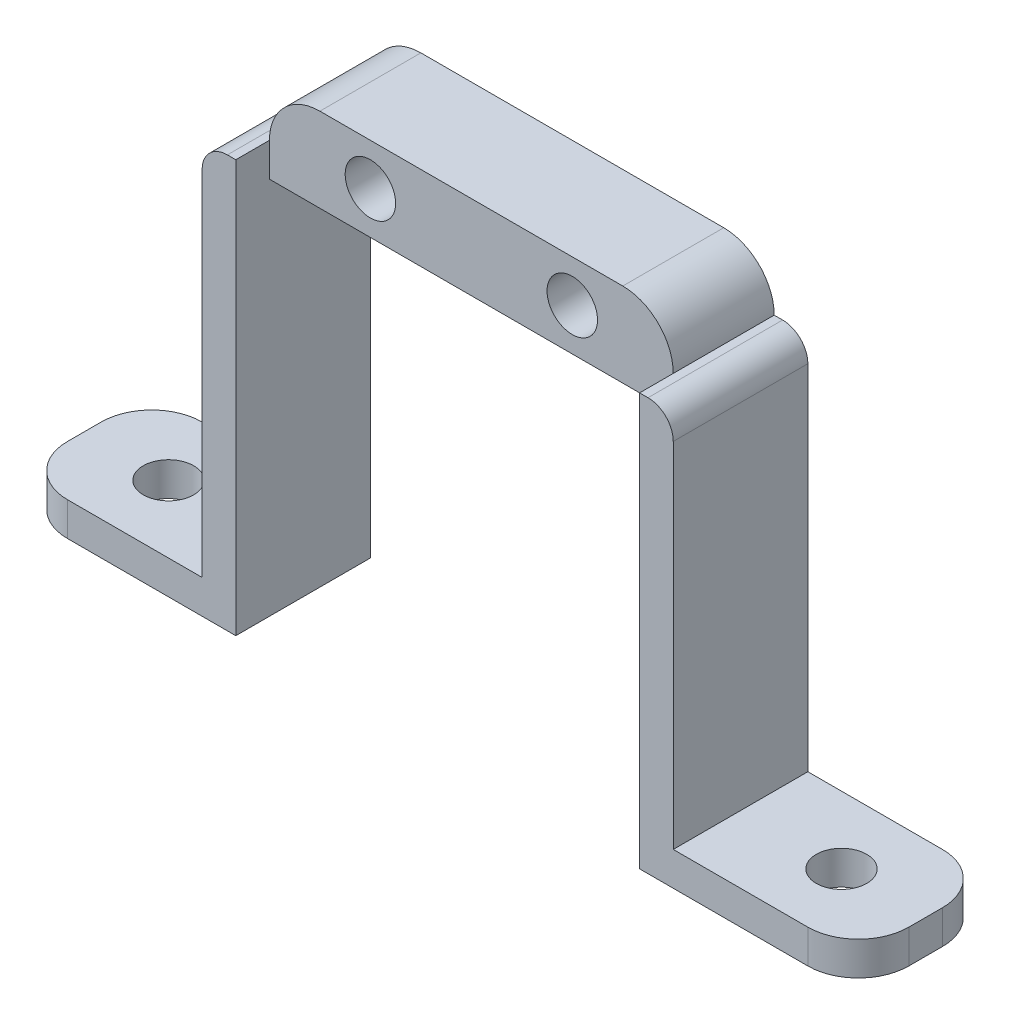
ISO-10303-21;
HEADER;
FILE_DESCRIPTION(('STEP AP214'),'2;1');
FILE_NAME('part.step','',(''),(''),'','','');
FILE_SCHEMA(('AUTOMOTIVE_DESIGN { 1 0 10303 214 1 1 1 1 }'));
ENDSEC;
DATA;
#1=APPLICATION_CONTEXT('core data for automotive mechanical design processes');
#2=APPLICATION_PROTOCOL_DEFINITION('international standard','automotive_design',2000,#1);
#3=PRODUCT_CONTEXT('',#1,'mechanical');
#4=PRODUCT('Part','Part','',(#3));
#5=PRODUCT_RELATED_PRODUCT_CATEGORY('part','',(#4));
#6=PRODUCT_DEFINITION_FORMATION('','',#4);
#7=PRODUCT_DEFINITION_CONTEXT('part definition',#1,'design');
#8=PRODUCT_DEFINITION('design','',#6,#7);
#9=PRODUCT_DEFINITION_SHAPE('','',#8);
#10=(LENGTH_UNIT() NAMED_UNIT(*) SI_UNIT(.MILLI.,.METRE.));
#11=(NAMED_UNIT(*) PLANE_ANGLE_UNIT() SI_UNIT($,.RADIAN.));
#12=(NAMED_UNIT(*) SI_UNIT($,.STERADIAN.) SOLID_ANGLE_UNIT());
#13=UNCERTAINTY_MEASURE_WITH_UNIT(LENGTH_MEASURE(1.E-05),#10,'distance_accuracy_value','');
#14=(GEOMETRIC_REPRESENTATION_CONTEXT(3) GLOBAL_UNCERTAINTY_ASSIGNED_CONTEXT((#13)) GLOBAL_UNIT_ASSIGNED_CONTEXT((#10,
#11,#12)) REPRESENTATION_CONTEXT('',''));
#15=CARTESIAN_POINT('',(0.,0.,0.));
#16=DIRECTION('',(0.,0.,1.));
#17=DIRECTION('',(1.,0.,0.));
#18=AXIS2_PLACEMENT_3D('',#15,#16,#17);
#19=CARTESIAN_POINT('',(13.,24.5,8.));
#20=DIRECTION('',(0.,1.,0.));
#21=DIRECTION('',(0.,0.,1.));
#22=AXIS2_PLACEMENT_3D('',#19,#20,#21);
#23=PLANE('',#22);
#24=DIRECTION('',(1.,0.,0.));
#25=VECTOR('',#24,1.);
#26=CARTESIAN_POINT('',(13.,24.5,0.));
#27=LINE('',#26,#25);
#28=CARTESIAN_POINT('',(12.5,24.5,0.));
#29=VERTEX_POINT('',#28);
#30=CARTESIAN_POINT('',(13.,24.5,0.));
#31=VERTEX_POINT('',#30);
#32=EDGE_CURVE('E213',#29,#31,#27,.T.);
#33=ORIENTED_EDGE('',*,*,#32,.F.);
#34=DIRECTION('',(0.,0.,-1.));
#35=VECTOR('',#34,1.);
#36=CARTESIAN_POINT('',(12.5,24.5,8.));
#37=LINE('',#36,#35);
#38=CARTESIAN_POINT('',(12.5,24.5,8.));
#39=VERTEX_POINT('',#38);
#40=EDGE_CURVE('E45',#29,#39,#37,.F.);
#41=ORIENTED_EDGE('',*,*,#40,.T.);
#42=DIRECTION('',(1.,0.,0.));
#43=VECTOR('',#42,1.);
#44=CARTESIAN_POINT('',(13.,24.5,8.));
#45=LINE('',#44,#43);
#46=CARTESIAN_POINT('',(13.,24.5,8.));
#47=VERTEX_POINT('',#46);
#48=EDGE_CURVE('E253',#39,#47,#45,.T.);
#49=ORIENTED_EDGE('',*,*,#48,.T.);
#50=DIRECTION('',(0.,0.,1.));
#51=VECTOR('',#50,1.);
#52=CARTESIAN_POINT('',(13.,24.5,6.));
#53=LINE('',#52,#51);
#54=CARTESIAN_POINT('',(13.,24.5,6.));
#55=VERTEX_POINT('',#54);
#56=EDGE_CURVE('E238',#55,#47,#53,.T.);
#57=ORIENTED_EDGE('',*,*,#56,.F.);
#58=DIRECTION('',(0.,0.,1.));
#59=VECTOR('',#58,1.);
#60=CARTESIAN_POINT('',(13.,24.5,6.));
#61=LINE('',#60,#59);
#62=EDGE_CURVE('E220',#31,#55,#61,.T.);
#63=ORIENTED_EDGE('',*,*,#62,.F.);
#64=EDGE_LOOP('',(#33,#41,#49,#57,#63));
#65=FACE_BOUND('',#64,.T.);
#66=ADVANCED_FACE('F37',(#65),#23,.T.);
#67=CARTESIAN_POINT('',(0.,0.,8.));
#68=DIRECTION('',(0.,0.,-1.));
#69=DIRECTION('',(-1.,0.,0.));
#70=AXIS2_PLACEMENT_3D('',#67,#68,#69);
#71=PLANE('',#70);
#72=ORIENTED_EDGE('',*,*,#48,.F.);
#73=CARTESIAN_POINT('',(12.5,23.,8.));
#74=DIRECTION('',(0.,0.,-1.));
#75=DIRECTION('',(-1.,0.,0.));
#76=AXIS2_PLACEMENT_3D('',#73,#74,#75);
#77=CIRCLE('',#76,1.5);
#78=CARTESIAN_POINT('',(11.,23.,8.));
#79=VERTEX_POINT('',#78);
#80=EDGE_CURVE('E11',#39,#79,#77,.F.);
#81=ORIENTED_EDGE('',*,*,#80,.T.);
#82=DIRECTION('',(0.,1.,0.));
#83=VECTOR('',#82,1.);
#84=CARTESIAN_POINT('',(11.,0.,8.));
#85=LINE('',#84,#83);
#86=CARTESIAN_POINT('',(11.,2.,8.));
#87=VERTEX_POINT('',#86);
#88=EDGE_CURVE('E255',#87,#79,#85,.T.);
#89=ORIENTED_EDGE('',*,*,#88,.F.);
#90=DIRECTION('',(1.,0.,0.));
#91=VECTOR('',#90,1.);
#92=CARTESIAN_POINT('',(0.,2.,8.));
#93=LINE('',#92,#91);
#94=CARTESIAN_POINT('',(3.,2.,8.));
#95=VERTEX_POINT('',#94);
#96=EDGE_CURVE('E257',#95,#87,#93,.T.);
#97=ORIENTED_EDGE('',*,*,#96,.F.);
#98=DIRECTION('',(0.,1.,0.));
#99=VECTOR('',#98,1.);
#100=CARTESIAN_POINT('',(3.,0.,8.));
#101=LINE('',#100,#99);
#102=CARTESIAN_POINT('',(3.,0.,8.));
#103=VERTEX_POINT('',#102);
#104=EDGE_CURVE('E367',#95,#103,#101,.F.);
#105=ORIENTED_EDGE('',*,*,#104,.T.);
#106=DIRECTION('',(1.,0.,0.));
#107=VECTOR('',#106,1.);
#108=CARTESIAN_POINT('',(0.,0.,8.));
#109=LINE('',#108,#107);
#110=CARTESIAN_POINT('',(13.,0.,8.));
#111=VERTEX_POINT('',#110);
#112=EDGE_CURVE('E259',#103,#111,#109,.T.);
#113=ORIENTED_EDGE('',*,*,#112,.T.);
#114=DIRECTION('',(0.,1.,0.));
#115=VECTOR('',#114,1.);
#116=CARTESIAN_POINT('',(13.,0.,8.));
#117=LINE('',#116,#115);
#118=EDGE_CURVE('E261',#111,#47,#117,.T.);
#119=ORIENTED_EDGE('',*,*,#118,.T.);
#120=EDGE_LOOP('',(#72,#81,#89,#97,#105,#113,#119));
#121=FACE_BOUND('',#120,.T.);
#122=ADVANCED_FACE('F392',(#121),#71,.F.);
#123=CARTESIAN_POINT('',(37.,0.,8.));
#124=DIRECTION('',(0.,1.,0.));
#125=DIRECTION('',(0.,0.,1.));
#126=AXIS2_PLACEMENT_3D('',#123,#124,#125);
#127=PLANE('',#126);
#128=CARTESIAN_POINT('',(45.,0.,4.));
#129=DIRECTION('',(0.,-1.,0.));
#130=DIRECTION('',(0.,0.,-1.));
#131=AXIS2_PLACEMENT_3D('',#128,#129,#130);
#132=CIRCLE('',#131,1.5);
#133=CARTESIAN_POINT('',(45.,0.,2.5));
#134=VERTEX_POINT('',#133);
#135=EDGE_CURVE('E703',#134,#134,#132,.T.);
#136=ORIENTED_EDGE('',*,*,#135,.F.);
#137=EDGE_LOOP('',(#136));
#138=FACE_BOUND('',#137,.T.);
#139=DIRECTION('',(0.,0.,-1.));
#140=VECTOR('',#139,1.);
#141=CARTESIAN_POINT('',(50.,0.,8.));
#142=LINE('',#141,#140);
#143=CARTESIAN_POINT('',(50.,0.,5.));
#144=VERTEX_POINT('',#143);
#145=CARTESIAN_POINT('',(50.,0.,3.));
#146=VERTEX_POINT('',#145);
#147=EDGE_CURVE('E311',#144,#146,#142,.T.);
#148=ORIENTED_EDGE('',*,*,#147,.F.);
#149=CARTESIAN_POINT('',(47.,0.,5.));
#150=DIRECTION('',(0.,1.,0.));
#151=DIRECTION('',(0.,0.,1.));
#152=AXIS2_PLACEMENT_3D('',#149,#150,#151);
#153=CIRCLE('',#152,3.);
#154=CARTESIAN_POINT('',(47.,0.,8.));
#155=VERTEX_POINT('',#154);
#156=EDGE_CURVE('E346',#144,#155,#153,.F.);
#157=ORIENTED_EDGE('',*,*,#156,.T.);
#158=DIRECTION('',(1.,0.,0.));
#159=VECTOR('',#158,1.);
#160=CARTESIAN_POINT('',(37.,0.,8.));
#161=LINE('',#160,#159);
#162=CARTESIAN_POINT('',(37.,0.,8.));
#163=VERTEX_POINT('',#162);
#164=EDGE_CURVE('E243',#163,#155,#161,.T.);
#165=ORIENTED_EDGE('',*,*,#164,.F.);
#166=DIRECTION('',(0.,0.,-1.));
#167=VECTOR('',#166,1.);
#168=CARTESIAN_POINT('',(37.,0.,8.));
#169=LINE('',#168,#167);
#170=CARTESIAN_POINT('',(37.,0.,0.));
#171=VERTEX_POINT('',#170);
#172=EDGE_CURVE('E266',#163,#171,#169,.T.);
#173=ORIENTED_EDGE('',*,*,#172,.T.);
#174=DIRECTION('',(1.,0.,0.));
#175=VECTOR('',#174,1.);
#176=CARTESIAN_POINT('',(37.,0.,0.));
#177=LINE('',#176,#175);
#178=CARTESIAN_POINT('',(47.,0.,0.));
#179=VERTEX_POINT('',#178);
#180=EDGE_CURVE('E241',#171,#179,#177,.T.);
#181=ORIENTED_EDGE('',*,*,#180,.T.);
#182=CARTESIAN_POINT('',(47.,0.,3.));
#183=DIRECTION('',(0.,1.,0.));
#184=DIRECTION('',(0.,0.,1.));
#185=AXIS2_PLACEMENT_3D('',#182,#183,#184);
#186=CIRCLE('',#185,3.);
#187=EDGE_CURVE('E344',#179,#146,#186,.F.);
#188=ORIENTED_EDGE('',*,*,#187,.T.);
#189=EDGE_LOOP('',(#148,#157,#165,#173,#181,#188));
#190=FACE_BOUND('',#189,.T.);
#191=ADVANCED_FACE('F430',(#138,#190),#127,.F.);
#192=CARTESIAN_POINT('',(50.,2.,8.));
#193=DIRECTION('',(1.,0.,0.));
#194=DIRECTION('',(0.,0.,-1.));
#195=AXIS2_PLACEMENT_3D('',#192,#193,#194);
#196=PLANE('',#195);
#197=DIRECTION('',(0.,0.,-1.));
#198=VECTOR('',#197,1.);
#199=CARTESIAN_POINT('',(50.,2.,8.));
#200=LINE('',#199,#198);
#201=CARTESIAN_POINT('',(50.,2.,5.));
#202=VERTEX_POINT('',#201);
#203=CARTESIAN_POINT('',(50.,2.,3.));
#204=VERTEX_POINT('',#203);
#205=EDGE_CURVE('E308',#202,#204,#200,.T.);
#206=ORIENTED_EDGE('',*,*,#205,.F.);
#207=DIRECTION('',(0.,-1.,0.));
#208=VECTOR('',#207,1.);
#209=CARTESIAN_POINT('',(50.,0.,5.));
#210=LINE('',#209,#208);
#211=EDGE_CURVE('E341',#202,#144,#210,.T.);
#212=ORIENTED_EDGE('',*,*,#211,.T.);
#213=ORIENTED_EDGE('',*,*,#147,.T.);
#214=DIRECTION('',(0.,-1.,0.));
#215=VECTOR('',#214,1.);
#216=CARTESIAN_POINT('',(50.,2.,3.));
#217=LINE('',#216,#215);
#218=EDGE_CURVE('E339',#146,#204,#217,.F.);
#219=ORIENTED_EDGE('',*,*,#218,.T.);
#220=EDGE_LOOP('',(#206,#212,#213,#219));
#221=FACE_BOUND('',#220,.T.);
#222=ADVANCED_FACE('F446',(#221),#196,.T.);
#223=CARTESIAN_POINT('',(37.,2.,8.));
#224=DIRECTION('',(0.,1.,0.));
#225=DIRECTION('',(0.,0.,1.));
#226=AXIS2_PLACEMENT_3D('',#223,#224,#225);
#227=PLANE('',#226);
#228=CARTESIAN_POINT('',(45.,2.,4.));
#229=DIRECTION('',(0.,1.,0.));
#230=DIRECTION('',(0.,0.,1.));
#231=AXIS2_PLACEMENT_3D('',#228,#229,#230);
#232=CIRCLE('',#231,1.5);
#233=CARTESIAN_POINT('',(45.,2.,5.5));
#234=VERTEX_POINT('',#233);
#235=EDGE_CURVE('E321',#234,#234,#232,.T.);
#236=ORIENTED_EDGE('',*,*,#235,.F.);
#237=EDGE_LOOP('',(#236));
#238=FACE_BOUND('',#237,.T.);
#239=DIRECTION('',(1.,0.,0.));
#240=VECTOR('',#239,1.);
#241=CARTESIAN_POINT('',(37.,2.,8.));
#242=LINE('',#241,#240);
#243=CARTESIAN_POINT('',(39.,2.,8.));
#244=VERTEX_POINT('',#243);
#245=CARTESIAN_POINT('',(47.,2.,8.));
#246=VERTEX_POINT('',#245);
#247=EDGE_CURVE('E246',#244,#246,#242,.T.);
#248=ORIENTED_EDGE('',*,*,#247,.T.);
#249=CARTESIAN_POINT('',(47.,2.,5.));
#250=DIRECTION('',(0.,1.,0.));
#251=DIRECTION('',(0.,0.,1.));
#252=AXIS2_PLACEMENT_3D('',#249,#250,#251);
#253=CIRCLE('',#252,3.);
#254=EDGE_CURVE('E352',#246,#202,#253,.T.);
#255=ORIENTED_EDGE('',*,*,#254,.T.);
#256=ORIENTED_EDGE('',*,*,#205,.T.);
#257=CARTESIAN_POINT('',(47.,2.,3.));
#258=DIRECTION('',(0.,1.,0.));
#259=DIRECTION('',(0.,0.,1.));
#260=AXIS2_PLACEMENT_3D('',#257,#258,#259);
#261=CIRCLE('',#260,3.);
#262=CARTESIAN_POINT('',(47.,2.,0.));
#263=VERTEX_POINT('',#262);
#264=EDGE_CURVE('E350',#204,#263,#261,.T.);
#265=ORIENTED_EDGE('',*,*,#264,.T.);
#266=DIRECTION('',(1.,0.,0.));
#267=VECTOR('',#266,1.);
#268=CARTESIAN_POINT('',(37.,2.,0.));
#269=LINE('',#268,#267);
#270=CARTESIAN_POINT('',(39.,2.,0.));
#271=VERTEX_POINT('',#270);
#272=EDGE_CURVE('E269',#271,#263,#269,.T.);
#273=ORIENTED_EDGE('',*,*,#272,.F.);
#274=DIRECTION('',(0.,0.,-1.));
#275=VECTOR('',#274,1.);
#276=CARTESIAN_POINT('',(39.,2.,8.));
#277=LINE('',#276,#275);
#278=EDGE_CURVE('E305',#244,#271,#277,.T.);
#279=ORIENTED_EDGE('',*,*,#278,.F.);
#280=EDGE_LOOP('',(#248,#255,#256,#265,#273,#279));
#281=FACE_BOUND('',#280,.T.);
#282=ADVANCED_FACE('F441',(#238,#281),#227,.T.);
#283=CARTESIAN_POINT('',(39.,22.5,8.));
#284=DIRECTION('',(1.,0.,0.));
#285=DIRECTION('',(0.,0.,-1.));
#286=AXIS2_PLACEMENT_3D('',#283,#284,#285);
#287=PLANE('',#286);
#288=DIRECTION('',(0.,1.,0.));
#289=VECTOR('',#288,1.);
#290=CARTESIAN_POINT('',(39.,22.5,0.));
#291=LINE('',#290,#289);
#292=CARTESIAN_POINT('',(39.,23.,0.));
#293=VERTEX_POINT('',#292);
#294=EDGE_CURVE('E214',#293,#271,#291,.F.);
#295=ORIENTED_EDGE('',*,*,#294,.F.);
#296=DIRECTION('',(0.,0.,-1.));
#297=VECTOR('',#296,1.);
#298=CARTESIAN_POINT('',(39.,23.,8.));
#299=LINE('',#298,#297);
#300=CARTESIAN_POINT('',(39.,23.,8.));
#301=VERTEX_POINT('',#300);
#302=EDGE_CURVE('E374',#293,#301,#299,.F.);
#303=ORIENTED_EDGE('',*,*,#302,.T.);
#304=DIRECTION('',(0.,1.,0.));
#305=VECTOR('',#304,1.);
#306=CARTESIAN_POINT('',(39.,22.5,8.));
#307=LINE('',#306,#305);
#308=EDGE_CURVE('E250',#301,#244,#307,.F.);
#309=ORIENTED_EDGE('',*,*,#308,.T.);
#310=ORIENTED_EDGE('',*,*,#278,.T.);
#311=EDGE_LOOP('',(#295,#303,#309,#310));
#312=FACE_BOUND('',#311,.T.);
#313=ADVANCED_FACE('F436',(#312),#287,.T.);
#314=CARTESIAN_POINT('',(37.,24.5,8.));
#315=VERTEX_POINT('',#314);
#316=CARTESIAN_POINT('',(37.5,24.5,8.));
#317=VERTEX_POINT('',#316);
#318=EDGE_CURVE('E252',#315,#317,#45,.T.);
#319=ORIENTED_EDGE('',*,*,#318,.T.);
#320=DIRECTION('',(0.,0.,-1.));
#321=VECTOR('',#320,1.);
#322=CARTESIAN_POINT('',(37.5,24.5,8.));
#323=LINE('',#322,#321);
#324=CARTESIAN_POINT('',(37.5,24.5,0.));
#325=VERTEX_POINT('',#324);
#326=EDGE_CURVE('E212',#317,#325,#323,.T.);
#327=ORIENTED_EDGE('',*,*,#326,.T.);
#328=CARTESIAN_POINT('',(37.,24.5,0.));
#329=VERTEX_POINT('',#328);
#330=EDGE_CURVE('E194',#329,#325,#27,.T.);
#331=ORIENTED_EDGE('',*,*,#330,.F.);
#332=DIRECTION('',(0.,0.,-1.));
#333=VECTOR('',#332,1.);
#334=CARTESIAN_POINT('',(37.,24.5,6.));
#335=LINE('',#334,#333);
#336=CARTESIAN_POINT('',(37.,24.5,6.));
#337=VERTEX_POINT('',#336);
#338=EDGE_CURVE('E209',#337,#329,#335,.T.);
#339=ORIENTED_EDGE('',*,*,#338,.F.);
#340=DIRECTION('',(0.,0.,1.));
#341=VECTOR('',#340,1.);
#342=CARTESIAN_POINT('',(37.,24.5,6.));
#343=LINE('',#342,#341);
#344=EDGE_CURVE('E237',#337,#315,#343,.T.);
#345=ORIENTED_EDGE('',*,*,#344,.T.);
#346=EDGE_LOOP('',(#319,#327,#331,#339,#345));
#347=FACE_BOUND('',#346,.T.);
#348=ADVANCED_FACE('F207',(#347),#23,.T.);
#349=CARTESIAN_POINT('',(11.,0.,8.));
#350=DIRECTION('',(-1.,0.,0.));
#351=DIRECTION('',(0.,0.,1.));
#352=AXIS2_PLACEMENT_3D('',#349,#350,#351);
#353=PLANE('',#352);
#354=ORIENTED_EDGE('',*,*,#88,.T.);
#355=DIRECTION('',(0.,0.,-1.));
#356=VECTOR('',#355,1.);
#357=CARTESIAN_POINT('',(11.,23.,8.));
#358=LINE('',#357,#356);
#359=CARTESIAN_POINT('',(11.,23.,0.));
#360=VERTEX_POINT('',#359);
#361=EDGE_CURVE('E378',#79,#360,#358,.T.);
#362=ORIENTED_EDGE('',*,*,#361,.T.);
#363=DIRECTION('',(0.,1.,0.));
#364=VECTOR('',#363,1.);
#365=CARTESIAN_POINT('',(11.,0.,0.));
#366=LINE('',#365,#364);
#367=CARTESIAN_POINT('',(11.,2.,0.));
#368=VERTEX_POINT('',#367);
#369=EDGE_CURVE('E273',#368,#360,#366,.T.);
#370=ORIENTED_EDGE('',*,*,#369,.F.);
#371=DIRECTION('',(0.,0.,-1.));
#372=VECTOR('',#371,1.);
#373=CARTESIAN_POINT('',(11.,2.,8.));
#374=LINE('',#373,#372);
#375=EDGE_CURVE('E302',#87,#368,#374,.T.);
#376=ORIENTED_EDGE('',*,*,#375,.F.);
#377=EDGE_LOOP('',(#354,#362,#370,#376));
#378=FACE_BOUND('',#377,.T.);
#379=ADVANCED_FACE('F383',(#378),#353,.T.);
#380=CARTESIAN_POINT('',(0.,2.,8.));
#381=DIRECTION('',(0.,1.,0.));
#382=DIRECTION('',(0.,0.,1.));
#383=AXIS2_PLACEMENT_3D('',#380,#381,#382);
#384=PLANE('',#383);
#385=CARTESIAN_POINT('',(5.,2.,3.99999999999999));
#386=DIRECTION('',(0.,1.,0.));
#387=DIRECTION('',(0.,0.,1.));
#388=AXIS2_PLACEMENT_3D('',#385,#386,#387);
#389=CIRCLE('',#388,1.5);
#390=CARTESIAN_POINT('',(5.,2.,5.5));
#391=VERTEX_POINT('',#390);
#392=EDGE_CURVE('E325',#391,#391,#389,.T.);
#393=ORIENTED_EDGE('',*,*,#392,.F.);
#394=EDGE_LOOP('',(#393));
#395=FACE_BOUND('',#394,.T.);
#396=DIRECTION('',(1.,0.,0.));
#397=VECTOR('',#396,1.);
#398=CARTESIAN_POINT('',(0.,2.,0.));
#399=LINE('',#398,#397);
#400=CARTESIAN_POINT('',(3.,2.,0.));
#401=VERTEX_POINT('',#400);
#402=EDGE_CURVE('E276',#401,#368,#399,.T.);
#403=ORIENTED_EDGE('',*,*,#402,.F.);
#404=CARTESIAN_POINT('',(3.,2.,3.));
#405=DIRECTION('',(0.,1.,0.));
#406=DIRECTION('',(0.,0.,1.));
#407=AXIS2_PLACEMENT_3D('',#404,#405,#406);
#408=CIRCLE('',#407,3.);
#409=CARTESIAN_POINT('',(0.,2.,3.));
#410=VERTEX_POINT('',#409);
#411=EDGE_CURVE('E356',#401,#410,#408,.T.);
#412=ORIENTED_EDGE('',*,*,#411,.T.);
#413=DIRECTION('',(0.,0.,-1.));
#414=VECTOR('',#413,1.);
#415=CARTESIAN_POINT('',(0.,2.,8.));
#416=LINE('',#415,#414);
#417=CARTESIAN_POINT('',(0.,2.,5.));
#418=VERTEX_POINT('',#417);
#419=EDGE_CURVE('E299',#418,#410,#416,.T.);
#420=ORIENTED_EDGE('',*,*,#419,.F.);
#421=CARTESIAN_POINT('',(3.,2.,5.));
#422=DIRECTION('',(0.,1.,0.));
#423=DIRECTION('',(0.,0.,1.));
#424=AXIS2_PLACEMENT_3D('',#421,#422,#423);
#425=CIRCLE('',#424,3.);
#426=EDGE_CURVE('E354',#418,#95,#425,.T.);
#427=ORIENTED_EDGE('',*,*,#426,.T.);
#428=ORIENTED_EDGE('',*,*,#96,.T.);
#429=ORIENTED_EDGE('',*,*,#375,.T.);
#430=EDGE_LOOP('',(#403,#412,#420,#427,#428,#429));
#431=FACE_BOUND('',#430,.T.);
#432=ADVANCED_FACE('F390',(#395,#431),#384,.T.);
#433=CARTESIAN_POINT('',(0.,0.,8.));
#434=DIRECTION('',(-1.,0.,0.));
#435=DIRECTION('',(0.,0.,1.));
#436=AXIS2_PLACEMENT_3D('',#433,#434,#435);
#437=PLANE('',#436);
#438=ORIENTED_EDGE('',*,*,#419,.T.);
#439=DIRECTION('',(0.,1.,0.));
#440=VECTOR('',#439,1.);
#441=CARTESIAN_POINT('',(0.,0.,3.));
#442=LINE('',#441,#440);
#443=CARTESIAN_POINT('',(0.,0.,3.));
#444=VERTEX_POINT('',#443);
#445=EDGE_CURVE('E361',#410,#444,#442,.F.);
#446=ORIENTED_EDGE('',*,*,#445,.T.);
#447=DIRECTION('',(0.,0.,-1.));
#448=VECTOR('',#447,1.);
#449=CARTESIAN_POINT('',(0.,0.,8.));
#450=LINE('',#449,#448);
#451=CARTESIAN_POINT('',(0.,0.,5.));
#452=VERTEX_POINT('',#451);
#453=EDGE_CURVE('E296',#452,#444,#450,.T.);
#454=ORIENTED_EDGE('',*,*,#453,.F.);
#455=DIRECTION('',(0.,1.,0.));
#456=VECTOR('',#455,1.);
#457=CARTESIAN_POINT('',(0.,2.,5.));
#458=LINE('',#457,#456);
#459=EDGE_CURVE('E358',#452,#418,#458,.T.);
#460=ORIENTED_EDGE('',*,*,#459,.T.);
#461=EDGE_LOOP('',(#438,#446,#454,#460));
#462=FACE_BOUND('',#461,.T.);
#463=ADVANCED_FACE('F405',(#462),#437,.T.);
#464=CARTESIAN_POINT('',(0.,0.,8.));
#465=DIRECTION('',(0.,1.,0.));
#466=DIRECTION('',(0.,0.,1.));
#467=AXIS2_PLACEMENT_3D('',#464,#465,#466);
#468=PLANE('',#467);
#469=CARTESIAN_POINT('',(5.,0.,3.99999999999999));
#470=DIRECTION('',(0.,-1.,0.));
#471=DIRECTION('',(0.,0.,1.));
#472=AXIS2_PLACEMENT_3D('',#469,#470,#471);
#473=CIRCLE('',#472,1.5);
#474=CARTESIAN_POINT('',(5.,0.,5.5));
#475=VERTEX_POINT('',#474);
#476=EDGE_CURVE('E704',#475,#475,#473,.T.);
#477=ORIENTED_EDGE('',*,*,#476,.F.);
#478=EDGE_LOOP('',(#477));
#479=FACE_BOUND('',#478,.T.);
#480=ORIENTED_EDGE('',*,*,#453,.T.);
#481=CARTESIAN_POINT('',(3.,0.,3.));
#482=DIRECTION('',(0.,1.,0.));
#483=DIRECTION('',(0.,0.,1.));
#484=AXIS2_PLACEMENT_3D('',#481,#482,#483);
#485=CIRCLE('',#484,3.);
#486=CARTESIAN_POINT('',(3.,0.,0.));
#487=VERTEX_POINT('',#486);
#488=EDGE_CURVE('E365',#444,#487,#485,.F.);
#489=ORIENTED_EDGE('',*,*,#488,.T.);
#490=DIRECTION('',(1.,0.,0.));
#491=VECTOR('',#490,1.);
#492=CARTESIAN_POINT('',(0.,0.,0.));
#493=LINE('',#492,#491);
#494=CARTESIAN_POINT('',(13.,0.,0.));
#495=VERTEX_POINT('',#494);
#496=EDGE_CURVE('E278',#487,#495,#493,.T.);
#497=ORIENTED_EDGE('',*,*,#496,.T.);
#498=DIRECTION('',(0.,0.,-1.));
#499=VECTOR('',#498,1.);
#500=CARTESIAN_POINT('',(13.,0.,8.));
#501=LINE('',#500,#499);
#502=EDGE_CURVE('E293',#111,#495,#501,.T.);
#503=ORIENTED_EDGE('',*,*,#502,.F.);
#504=ORIENTED_EDGE('',*,*,#112,.F.);
#505=CARTESIAN_POINT('',(3.,0.,5.));
#506=DIRECTION('',(0.,1.,0.));
#507=DIRECTION('',(0.,0.,1.));
#508=AXIS2_PLACEMENT_3D('',#505,#506,#507);
#509=CIRCLE('',#508,3.);
#510=EDGE_CURVE('E363',#103,#452,#509,.F.);
#511=ORIENTED_EDGE('',*,*,#510,.T.);
#512=EDGE_LOOP('',(#480,#489,#497,#503,#504,#511));
#513=FACE_BOUND('',#512,.T.);
#514=ADVANCED_FACE('F401',(#479,#513),#468,.F.);
#515=CARTESIAN_POINT('',(13.,0.,8.));
#516=DIRECTION('',(-1.,0.,0.));
#517=DIRECTION('',(0.,0.,1.));
#518=AXIS2_PLACEMENT_3D('',#515,#516,#517);
#519=PLANE('',#518);
#520=DIRECTION('',(0.,1.,0.));
#521=VECTOR('',#520,1.);
#522=CARTESIAN_POINT('',(13.,0.,0.));
#523=LINE('',#522,#521);
#524=CARTESIAN_POINT('',(13.,22.5,0.));
#525=VERTEX_POINT('',#524);
#526=EDGE_CURVE('E280',#495,#525,#523,.T.);
#527=ORIENTED_EDGE('',*,*,#526,.T.);
#528=DIRECTION('',(0.,0.,-1.));
#529=VECTOR('',#528,1.);
#530=CARTESIAN_POINT('',(13.,22.5,8.));
#531=LINE('',#530,#529);
#532=CARTESIAN_POINT('',(13.,22.5,6.));
#533=VERTEX_POINT('',#532);
#534=EDGE_CURVE('E291',#533,#525,#531,.T.);
#535=ORIENTED_EDGE('',*,*,#534,.F.);
#536=DIRECTION('',(0.,-1.,0.));
#537=VECTOR('',#536,1.);
#538=CARTESIAN_POINT('',(13.,22.5,6.));
#539=LINE('',#538,#537);
#540=EDGE_CURVE('E229',#55,#533,#539,.T.);
#541=ORIENTED_EDGE('',*,*,#540,.F.);
#542=ORIENTED_EDGE('',*,*,#56,.T.);
#543=ORIENTED_EDGE('',*,*,#118,.F.);
#544=ORIENTED_EDGE('',*,*,#502,.T.);
#545=EDGE_LOOP('',(#527,#535,#541,#542,#543,#544));
#546=FACE_BOUND('',#545,.T.);
#547=ADVANCED_FACE('F415',(#546),#519,.F.);
#548=CARTESIAN_POINT('',(13.,22.5,8.));
#549=DIRECTION('',(0.,1.,0.));
#550=DIRECTION('',(0.,0.,1.));
#551=AXIS2_PLACEMENT_3D('',#548,#549,#550);
#552=PLANE('',#551);
#553=DIRECTION('',(0.,0.,-1.));
#554=VECTOR('',#553,1.);
#555=CARTESIAN_POINT('',(37.,22.5,8.));
#556=LINE('',#555,#554);
#557=CARTESIAN_POINT('',(37.,22.5,6.));
#558=VERTEX_POINT('',#557);
#559=CARTESIAN_POINT('',(37.,22.5,0.));
#560=VERTEX_POINT('',#559);
#561=EDGE_CURVE('E289',#558,#560,#556,.T.);
#562=ORIENTED_EDGE('',*,*,#561,.F.);
#563=DIRECTION('',(1.,0.,0.));
#564=VECTOR('',#563,1.);
#565=CARTESIAN_POINT('',(13.,22.5,6.));
#566=LINE('',#565,#564);
#567=EDGE_CURVE('E231',#533,#558,#566,.T.);
#568=ORIENTED_EDGE('',*,*,#567,.F.);
#569=ORIENTED_EDGE('',*,*,#534,.T.);
#570=DIRECTION('',(1.,0.,0.));
#571=VECTOR('',#570,1.);
#572=CARTESIAN_POINT('',(13.,22.5,0.));
#573=LINE('',#572,#571);
#574=EDGE_CURVE('E283',#525,#560,#573,.T.);
#575=ORIENTED_EDGE('',*,*,#574,.T.);
#576=EDGE_LOOP('',(#562,#568,#569,#575));
#577=FACE_BOUND('',#576,.T.);
#578=ADVANCED_FACE('F557',(#577),#552,.F.);
#579=CARTESIAN_POINT('',(37.,22.5,8.));
#580=DIRECTION('',(1.,0.,0.));
#581=DIRECTION('',(0.,0.,-1.));
#582=AXIS2_PLACEMENT_3D('',#579,#580,#581);
#583=PLANE('',#582);
#584=DIRECTION('',(0.,-1.,0.));
#585=VECTOR('',#584,1.);
#586=CARTESIAN_POINT('',(37.,22.5,0.));
#587=LINE('',#586,#585);
#588=EDGE_CURVE('E247',#560,#171,#587,.T.);
#589=ORIENTED_EDGE('',*,*,#588,.T.);
#590=ORIENTED_EDGE('',*,*,#172,.F.);
#591=DIRECTION('',(0.,-1.,0.));
#592=VECTOR('',#591,1.);
#593=CARTESIAN_POINT('',(37.,22.5,8.));
#594=LINE('',#593,#592);
#595=EDGE_CURVE('E264',#315,#163,#594,.T.);
#596=ORIENTED_EDGE('',*,*,#595,.F.);
#597=ORIENTED_EDGE('',*,*,#344,.F.);
#598=DIRECTION('',(0.,1.,0.));
#599=VECTOR('',#598,1.);
#600=CARTESIAN_POINT('',(37.,22.5,6.));
#601=LINE('',#600,#599);
#602=EDGE_CURVE('E234',#558,#337,#601,.T.);
#603=ORIENTED_EDGE('',*,*,#602,.F.);
#604=ORIENTED_EDGE('',*,*,#561,.T.);
#605=EDGE_LOOP('',(#589,#590,#596,#597,#603,#604));
#606=FACE_BOUND('',#605,.T.);
#607=ADVANCED_FACE('F510',(#606),#583,.F.);
#608=ORIENTED_EDGE('',*,*,#308,.F.);
#609=CARTESIAN_POINT('',(37.5,23.,8.));
#610=DIRECTION('',(0.,0.,-1.));
#611=DIRECTION('',(-1.,0.,0.));
#612=AXIS2_PLACEMENT_3D('',#609,#610,#611);
#613=CIRCLE('',#612,1.5);
#614=EDGE_CURVE('E376',#301,#317,#613,.F.);
#615=ORIENTED_EDGE('',*,*,#614,.T.);
#616=ORIENTED_EDGE('',*,*,#318,.F.);
#617=ORIENTED_EDGE('',*,*,#595,.T.);
#618=ORIENTED_EDGE('',*,*,#164,.T.);
#619=DIRECTION('',(0.,-1.,0.));
#620=VECTOR('',#619,1.);
#621=CARTESIAN_POINT('',(47.,2.,8.));
#622=LINE('',#621,#620);
#623=EDGE_CURVE('E348',#155,#246,#622,.F.);
#624=ORIENTED_EDGE('',*,*,#623,.T.);
#625=ORIENTED_EDGE('',*,*,#247,.F.);
#626=EDGE_LOOP('',(#608,#615,#616,#617,#618,#624,#625));
#627=FACE_BOUND('',#626,.T.);
#628=ADVANCED_FACE('F432',(#627),#71,.F.);
#629=CARTESIAN_POINT('',(0.,0.,0.));
#630=DIRECTION('',(0.,0.,-1.));
#631=DIRECTION('',(-1.,0.,0.));
#632=AXIS2_PLACEMENT_3D('',#629,#630,#631);
#633=PLANE('',#632);
#634=CARTESIAN_POINT('',(19.,25.,0.));
#635=DIRECTION('',(0.,0.,-1.));
#636=DIRECTION('',(-1.,0.,0.));
#637=AXIS2_PLACEMENT_3D('',#634,#635,#636);
#638=CIRCLE('',#637,1.5);
#639=CARTESIAN_POINT('',(17.5,25.,0.));
#640=VERTEX_POINT('',#639);
#641=EDGE_CURVE('E318',#640,#640,#638,.T.);
#642=ORIENTED_EDGE('',*,*,#641,.F.);
#643=EDGE_LOOP('',(#642));
#644=FACE_BOUND('',#643,.T.);
#645=CARTESIAN_POINT('',(31.,25.,0.));
#646=DIRECTION('',(0.,0.,-1.));
#647=DIRECTION('',(1.,0.,0.));
#648=AXIS2_PLACEMENT_3D('',#645,#646,#647);
#649=CIRCLE('',#648,1.5);
#650=CARTESIAN_POINT('',(32.5,25.,0.));
#651=VERTEX_POINT('',#650);
#652=EDGE_CURVE('E324',#651,#651,#649,.T.);
#653=ORIENTED_EDGE('',*,*,#652,.F.);
#654=EDGE_LOOP('',(#653));
#655=FACE_BOUND('',#654,.T.);
#656=ORIENTED_EDGE('',*,*,#330,.T.);
#657=CARTESIAN_POINT('',(37.5,23.,0.));
#658=DIRECTION('',(0.,0.,-1.));
#659=DIRECTION('',(-1.,0.,0.));
#660=AXIS2_PLACEMENT_3D('',#657,#658,#659);
#661=CIRCLE('',#660,1.5);
#662=EDGE_CURVE('E372',#325,#293,#661,.T.);
#663=ORIENTED_EDGE('',*,*,#662,.T.);
#664=ORIENTED_EDGE('',*,*,#294,.T.);
#665=ORIENTED_EDGE('',*,*,#272,.T.);
#666=DIRECTION('',(0.,-1.,0.));
#667=VECTOR('',#666,1.);
#668=CARTESIAN_POINT('',(47.,0.,0.));
#669=LINE('',#668,#667);
#670=EDGE_CURVE('E202',#263,#179,#669,.T.);
#671=ORIENTED_EDGE('',*,*,#670,.T.);
#672=ORIENTED_EDGE('',*,*,#180,.F.);
#673=ORIENTED_EDGE('',*,*,#588,.F.);
#674=ORIENTED_EDGE('',*,*,#574,.F.);
#675=ORIENTED_EDGE('',*,*,#526,.F.);
#676=ORIENTED_EDGE('',*,*,#496,.F.);
#677=DIRECTION('',(0.,1.,0.));
#678=VECTOR('',#677,1.);
#679=CARTESIAN_POINT('',(3.,0.,0.));
#680=LINE('',#679,#678);
#681=EDGE_CURVE('E333',#487,#401,#680,.T.);
#682=ORIENTED_EDGE('',*,*,#681,.T.);
#683=ORIENTED_EDGE('',*,*,#402,.T.);
#684=ORIENTED_EDGE('',*,*,#369,.T.);
#685=CARTESIAN_POINT('',(12.5,23.,0.));
#686=DIRECTION('',(0.,0.,-1.));
#687=DIRECTION('',(-1.,0.,0.));
#688=AXIS2_PLACEMENT_3D('',#685,#686,#687);
#689=CIRCLE('',#688,1.5);
#690=EDGE_CURVE('E370',#360,#29,#689,.T.);
#691=ORIENTED_EDGE('',*,*,#690,.T.);
#692=ORIENTED_EDGE('',*,*,#32,.T.);
#693=CARTESIAN_POINT('',(16.,24.5,0.));
#694=DIRECTION('',(0.,0.,-1.));
#695=DIRECTION('',(-1.,0.,0.));
#696=AXIS2_PLACEMENT_3D('',#693,#694,#695);
#697=CIRCLE('',#696,3.);
#698=CARTESIAN_POINT('',(16.,27.5,0.));
#699=VERTEX_POINT('',#698);
#700=EDGE_CURVE('E201',#31,#699,#697,.T.);
#701=ORIENTED_EDGE('',*,*,#700,.T.);
#702=DIRECTION('',(-1.,0.,0.));
#703=VECTOR('',#702,1.);
#704=CARTESIAN_POINT('',(13.,27.5,0.));
#705=LINE('',#704,#703);
#706=CARTESIAN_POINT('',(34.,27.5,0.));
#707=VERTEX_POINT('',#706);
#708=EDGE_CURVE('E196',#707,#699,#705,.T.);
#709=ORIENTED_EDGE('',*,*,#708,.F.);
#710=CARTESIAN_POINT('',(34.,24.5,0.));
#711=DIRECTION('',(0.,0.,-1.));
#712=DIRECTION('',(-1.,0.,0.));
#713=AXIS2_PLACEMENT_3D('',#710,#711,#712);
#714=CIRCLE('',#713,3.);
#715=EDGE_CURVE('E191',#707,#329,#714,.T.);
#716=ORIENTED_EDGE('',*,*,#715,.T.);
#717=EDGE_LOOP('',(#656,#663,#664,#665,#671,#672,#673,#674,#675,#676,#682,#683,#684,#691,#692,
#701,#709,#716));
#718=FACE_BOUND('',#717,.T.);
#719=ADVANCED_FACE('F193',(#644,#655,#718),#633,.T.);
#720=CARTESIAN_POINT('',(0.,0.,6.));
#721=DIRECTION('',(0.,0.,-1.));
#722=DIRECTION('',(-1.,0.,0.));
#723=AXIS2_PLACEMENT_3D('',#720,#721,#722);
#724=PLANE('',#723);
#725=CARTESIAN_POINT('',(19.,25.,6.));
#726=DIRECTION('',(0.,0.,-1.));
#727=DIRECTION('',(-1.,0.,0.));
#728=AXIS2_PLACEMENT_3D('',#725,#726,#727);
#729=CIRCLE('',#728,1.5);
#730=CARTESIAN_POINT('',(17.5,25.,6.));
#731=VERTEX_POINT('',#730);
#732=EDGE_CURVE('E225',#731,#731,#729,.T.);
#733=ORIENTED_EDGE('',*,*,#732,.T.);
#734=EDGE_LOOP('',(#733));
#735=FACE_BOUND('',#734,.T.);
#736=CARTESIAN_POINT('',(31.,25.,6.));
#737=DIRECTION('',(0.,0.,-1.));
#738=DIRECTION('',(-1.,0.,0.));
#739=AXIS2_PLACEMENT_3D('',#736,#737,#738);
#740=CIRCLE('',#739,1.5);
#741=CARTESIAN_POINT('',(29.5,25.,6.));
#742=VERTEX_POINT('',#741);
#743=EDGE_CURVE('E315',#742,#742,#740,.T.);
#744=ORIENTED_EDGE('',*,*,#743,.T.);
#745=EDGE_LOOP('',(#744));
#746=FACE_BOUND('',#745,.T.);
#747=DIRECTION('',(1.,0.,0.));
#748=VECTOR('',#747,1.);
#749=CARTESIAN_POINT('',(13.,27.5,6.));
#750=LINE('',#749,#748);
#751=CARTESIAN_POINT('',(16.,27.5,6.));
#752=VERTEX_POINT('',#751);
#753=CARTESIAN_POINT('',(34.,27.5,6.));
#754=VERTEX_POINT('',#753);
#755=EDGE_CURVE('E219',#752,#754,#750,.T.);
#756=ORIENTED_EDGE('',*,*,#755,.F.);
#757=CARTESIAN_POINT('',(16.,24.5,6.));
#758=DIRECTION('',(0.,0.,-1.));
#759=DIRECTION('',(-1.,0.,0.));
#760=AXIS2_PLACEMENT_3D('',#757,#758,#759);
#761=CIRCLE('',#760,3.);
#762=EDGE_CURVE('E331',#752,#55,#761,.F.);
#763=ORIENTED_EDGE('',*,*,#762,.T.);
#764=ORIENTED_EDGE('',*,*,#540,.T.);
#765=ORIENTED_EDGE('',*,*,#567,.T.);
#766=ORIENTED_EDGE('',*,*,#602,.T.);
#767=CARTESIAN_POINT('',(34.,24.5,6.));
#768=DIRECTION('',(0.,0.,-1.));
#769=DIRECTION('',(-1.,0.,0.));
#770=AXIS2_PLACEMENT_3D('',#767,#768,#769);
#771=CIRCLE('',#770,3.);
#772=EDGE_CURVE('E218',#337,#754,#771,.F.);
#773=ORIENTED_EDGE('',*,*,#772,.T.);
#774=EDGE_LOOP('',(#756,#763,#764,#765,#766,#773));
#775=FACE_BOUND('',#774,.T.);
#776=ADVANCED_FACE('F496',(#735,#746,#775),#724,.F.);
#777=CARTESIAN_POINT('',(0.,27.5,0.));
#778=DIRECTION('',(0.,-1.,0.));
#779=DIRECTION('',(0.,0.,-1.));
#780=AXIS2_PLACEMENT_3D('',#777,#778,#779);
#781=PLANE('',#780);
#782=ORIENTED_EDGE('',*,*,#708,.T.);
#783=DIRECTION('',(0.,0.,1.));
#784=VECTOR('',#783,1.);
#785=CARTESIAN_POINT('',(16.,27.5,0.));
#786=LINE('',#785,#784);
#787=EDGE_CURVE('E327',#699,#752,#786,.T.);
#788=ORIENTED_EDGE('',*,*,#787,.T.);
#789=ORIENTED_EDGE('',*,*,#755,.T.);
#790=DIRECTION('',(0.,0.,-1.));
#791=VECTOR('',#790,1.);
#792=CARTESIAN_POINT('',(34.,27.5,0.));
#793=LINE('',#792,#791);
#794=EDGE_CURVE('E314',#754,#707,#793,.T.);
#795=ORIENTED_EDGE('',*,*,#794,.T.);
#796=EDGE_LOOP('',(#782,#788,#789,#795));
#797=FACE_BOUND('',#796,.T.);
#798=ADVANCED_FACE('F547',(#797),#781,.F.);
#799=CARTESIAN_POINT('',(31.,25.,8.));
#800=DIRECTION('',(0.,0.,-1.));
#801=DIRECTION('',(-1.,0.,0.));
#802=AXIS2_PLACEMENT_3D('',#799,#800,#801);
#803=CYLINDRICAL_SURFACE('',#802,1.5);
#804=ORIENTED_EDGE('',*,*,#652,.T.);
#805=EDGE_LOOP('',(#804));
#806=FACE_BOUND('',#805,.T.);
#807=ORIENTED_EDGE('',*,*,#743,.F.);
#808=EDGE_LOOP('',(#807));
#809=FACE_BOUND('',#808,.T.);
#810=ADVANCED_FACE('F642',(#806,#809),#803,.F.);
#811=CARTESIAN_POINT('',(19.,25.,8.));
#812=DIRECTION('',(0.,0.,-1.));
#813=DIRECTION('',(-1.,0.,0.));
#814=AXIS2_PLACEMENT_3D('',#811,#812,#813);
#815=CYLINDRICAL_SURFACE('',#814,1.5);
#816=ORIENTED_EDGE('',*,*,#641,.T.);
#817=EDGE_LOOP('',(#816));
#818=FACE_BOUND('',#817,.T.);
#819=ORIENTED_EDGE('',*,*,#732,.F.);
#820=EDGE_LOOP('',(#819));
#821=FACE_BOUND('',#820,.T.);
#822=ADVANCED_FACE('F632',(#818,#821),#815,.F.);
#823=CARTESIAN_POINT('',(5.,27.5,3.99999999999999));
#824=DIRECTION('',(0.,-1.,0.));
#825=DIRECTION('',(0.,0.,-1.));
#826=AXIS2_PLACEMENT_3D('',#823,#824,#825);
#827=CYLINDRICAL_SURFACE('',#826,1.5);
#828=ORIENTED_EDGE('',*,*,#392,.T.);
#829=EDGE_LOOP('',(#828));
#830=FACE_BOUND('',#829,.T.);
#831=ORIENTED_EDGE('',*,*,#476,.T.);
#832=EDGE_LOOP('',(#831));
#833=FACE_BOUND('',#832,.T.);
#834=ADVANCED_FACE('F621',(#830,#833),#827,.F.);
#835=CARTESIAN_POINT('',(45.,27.5,4.));
#836=DIRECTION('',(0.,-1.,0.));
#837=DIRECTION('',(0.,0.,-1.));
#838=AXIS2_PLACEMENT_3D('',#835,#836,#837);
#839=CYLINDRICAL_SURFACE('',#838,1.5);
#840=ORIENTED_EDGE('',*,*,#235,.T.);
#841=EDGE_LOOP('',(#840));
#842=FACE_BOUND('',#841,.T.);
#843=ORIENTED_EDGE('',*,*,#135,.T.);
#844=EDGE_LOOP('',(#843));
#845=FACE_BOUND('',#844,.T.);
#846=ADVANCED_FACE('F460',(#842,#845),#839,.F.);
#847=CARTESIAN_POINT('',(16.,24.5,0.));
#848=DIRECTION('',(0.,0.,1.));
#849=DIRECTION('',(1.,0.,0.));
#850=AXIS2_PLACEMENT_3D('',#847,#848,#849);
#851=CYLINDRICAL_SURFACE('',#850,3.);
#852=ORIENTED_EDGE('',*,*,#700,.F.);
#853=ORIENTED_EDGE('',*,*,#62,.T.);
#854=ORIENTED_EDGE('',*,*,#762,.F.);
#855=ORIENTED_EDGE('',*,*,#787,.F.);
#856=EDGE_LOOP('',(#852,#853,#854,#855));
#857=FACE_BOUND('',#856,.T.);
#858=ADVANCED_FACE('F457',(#857),#851,.T.);
#859=CARTESIAN_POINT('',(34.,24.5,0.));
#860=DIRECTION('',(0.,0.,-1.));
#861=DIRECTION('',(-1.,0.,0.));
#862=AXIS2_PLACEMENT_3D('',#859,#860,#861);
#863=CYLINDRICAL_SURFACE('',#862,3.);
#864=ORIENTED_EDGE('',*,*,#772,.F.);
#865=ORIENTED_EDGE('',*,*,#338,.T.);
#866=ORIENTED_EDGE('',*,*,#715,.F.);
#867=ORIENTED_EDGE('',*,*,#794,.F.);
#868=EDGE_LOOP('',(#864,#865,#866,#867));
#869=FACE_BOUND('',#868,.T.);
#870=ADVANCED_FACE('F217',(#869),#863,.T.);
#871=CARTESIAN_POINT('',(47.,2.,5.));
#872=DIRECTION('',(0.,1.,0.));
#873=DIRECTION('',(0.,0.,1.));
#874=AXIS2_PLACEMENT_3D('',#871,#872,#873);
#875=CYLINDRICAL_SURFACE('',#874,3.);
#876=ORIENTED_EDGE('',*,*,#254,.F.);
#877=ORIENTED_EDGE('',*,*,#623,.F.);
#878=ORIENTED_EDGE('',*,*,#156,.F.);
#879=ORIENTED_EDGE('',*,*,#211,.F.);
#880=EDGE_LOOP('',(#876,#877,#878,#879));
#881=FACE_BOUND('',#880,.T.);
#882=ADVANCED_FACE('F464',(#881),#875,.T.);
#883=CARTESIAN_POINT('',(47.,0.,3.));
#884=DIRECTION('',(0.,-1.,0.));
#885=DIRECTION('',(0.,0.,-1.));
#886=AXIS2_PLACEMENT_3D('',#883,#884,#885);
#887=CYLINDRICAL_SURFACE('',#886,3.);
#888=ORIENTED_EDGE('',*,*,#264,.F.);
#889=ORIENTED_EDGE('',*,*,#218,.F.);
#890=ORIENTED_EDGE('',*,*,#187,.F.);
#891=ORIENTED_EDGE('',*,*,#670,.F.);
#892=EDGE_LOOP('',(#888,#889,#890,#891));
#893=FACE_BOUND('',#892,.T.);
#894=ADVANCED_FACE('F467',(#893),#887,.T.);
#895=CARTESIAN_POINT('',(3.,0.,3.));
#896=DIRECTION('',(0.,1.,0.));
#897=DIRECTION('',(0.,0.,1.));
#898=AXIS2_PLACEMENT_3D('',#895,#896,#897);
#899=CYLINDRICAL_SURFACE('',#898,3.);
#900=ORIENTED_EDGE('',*,*,#488,.F.);
#901=ORIENTED_EDGE('',*,*,#445,.F.);
#902=ORIENTED_EDGE('',*,*,#411,.F.);
#903=ORIENTED_EDGE('',*,*,#681,.F.);
#904=EDGE_LOOP('',(#900,#901,#902,#903));
#905=FACE_BOUND('',#904,.T.);
#906=ADVANCED_FACE('F409',(#905),#899,.T.);
#907=CARTESIAN_POINT('',(3.,0.,5.));
#908=DIRECTION('',(0.,-1.,0.));
#909=DIRECTION('',(0.,0.,-1.));
#910=AXIS2_PLACEMENT_3D('',#907,#908,#909);
#911=CYLINDRICAL_SURFACE('',#910,3.);
#912=ORIENTED_EDGE('',*,*,#510,.F.);
#913=ORIENTED_EDGE('',*,*,#104,.F.);
#914=ORIENTED_EDGE('',*,*,#426,.F.);
#915=ORIENTED_EDGE('',*,*,#459,.F.);
#916=EDGE_LOOP('',(#912,#913,#914,#915));
#917=FACE_BOUND('',#916,.T.);
#918=ADVANCED_FACE('F397',(#917),#911,.T.);
#919=CARTESIAN_POINT('',(37.5,23.,8.));
#920=DIRECTION('',(0.,0.,-1.));
#921=DIRECTION('',(-1.,0.,0.));
#922=AXIS2_PLACEMENT_3D('',#919,#920,#921);
#923=CYLINDRICAL_SURFACE('',#922,1.5);
#924=ORIENTED_EDGE('',*,*,#614,.F.);
#925=ORIENTED_EDGE('',*,*,#302,.F.);
#926=ORIENTED_EDGE('',*,*,#662,.F.);
#927=ORIENTED_EDGE('',*,*,#326,.F.);
#928=EDGE_LOOP('',(#924,#925,#926,#927));
#929=FACE_BOUND('',#928,.T.);
#930=ADVANCED_FACE('F420',(#929),#923,.T.);
#931=CARTESIAN_POINT('',(12.5,23.,8.));
#932=DIRECTION('',(0.,0.,-1.));
#933=DIRECTION('',(-1.,0.,0.));
#934=AXIS2_PLACEMENT_3D('',#931,#932,#933);
#935=CYLINDRICAL_SURFACE('',#934,1.5);
#936=ORIENTED_EDGE('',*,*,#80,.F.);
#937=ORIENTED_EDGE('',*,*,#40,.F.);
#938=ORIENTED_EDGE('',*,*,#690,.F.);
#939=ORIENTED_EDGE('',*,*,#361,.F.);
#940=EDGE_LOOP('',(#936,#937,#938,#939));
#941=FACE_BOUND('',#940,.T.);
#942=ADVANCED_FACE('F39',(#941),#935,.T.);
#943=CLOSED_SHELL('',(#66,#122,#191,#222,#282,#313,#348,#379,#432,#463,#514,#547,#578,#607,#628,
#719,#776,#798,#810,#822,#834,#846,#858,#870,#882,#894,#906,#918,#930,#942));
#944=MANIFOLD_SOLID_BREP('B2',#943);
#945=ADVANCED_BREP_SHAPE_REPRESENTATION('',(#18,#944),#14);
#946=SHAPE_DEFINITION_REPRESENTATION(#9,#945);
ENDSEC;
END-ISO-10303-21;
